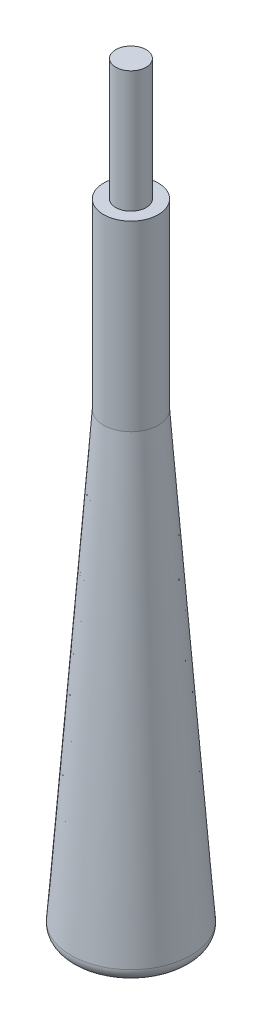
ISO-10303-21;
HEADER;
FILE_DESCRIPTION(('STEP AP214'),'2;1');
FILE_NAME('part.step','',(''),(''),'','','');
FILE_SCHEMA(('AUTOMOTIVE_DESIGN { 1 0 10303 214 1 1 1 1 }'));
ENDSEC;
DATA;
#1=APPLICATION_CONTEXT('core data for automotive mechanical design processes');
#2=APPLICATION_PROTOCOL_DEFINITION('international standard','automotive_design',2000,#1);
#3=PRODUCT_CONTEXT('',#1,'mechanical');
#4=PRODUCT('Part','Part','',(#3));
#5=PRODUCT_RELATED_PRODUCT_CATEGORY('part','',(#4));
#6=PRODUCT_DEFINITION_FORMATION('','',#4);
#7=PRODUCT_DEFINITION_CONTEXT('part definition',#1,'design');
#8=PRODUCT_DEFINITION('design','',#6,#7);
#9=PRODUCT_DEFINITION_SHAPE('','',#8);
#10=(LENGTH_UNIT() NAMED_UNIT(*) SI_UNIT(.MILLI.,.METRE.));
#11=(NAMED_UNIT(*) PLANE_ANGLE_UNIT() SI_UNIT($,.RADIAN.));
#12=(NAMED_UNIT(*) SI_UNIT($,.STERADIAN.) SOLID_ANGLE_UNIT());
#13=UNCERTAINTY_MEASURE_WITH_UNIT(LENGTH_MEASURE(1.E-05),#10,'distance_accuracy_value','');
#14=(GEOMETRIC_REPRESENTATION_CONTEXT(3) GLOBAL_UNCERTAINTY_ASSIGNED_CONTEXT((#13)) GLOBAL_UNIT_ASSIGNED_CONTEXT((#10,
#11,#12)) REPRESENTATION_CONTEXT('',''));
#15=CARTESIAN_POINT('',(0.,0.,0.));
#16=DIRECTION('',(0.,0.,1.));
#17=DIRECTION('',(1.,0.,0.));
#18=AXIS2_PLACEMENT_3D('',#15,#16,#17);
#19=CARTESIAN_POINT('',(0.,20.,-1.11022302462516E-13));
#20=DIRECTION('',(0.,-1.,0.));
#21=DIRECTION('',(0.,0.,-1.));
#22=AXIS2_PLACEMENT_3D('',#19,#20,#21);
#23=CYLINDRICAL_SURFACE('',#22,2.5);
#24=CARTESIAN_POINT('',(0.,20.,-1.11022302462516E-13));
#25=DIRECTION('',(0.,1.,0.));
#26=DIRECTION('',(0.,0.,1.));
#27=AXIS2_PLACEMENT_3D('',#24,#25,#26);
#28=CIRCLE('',#27,2.5);
#29=CARTESIAN_POINT('',(0.,20.,2.49999999999989));
#30=VERTEX_POINT('',#29);
#31=EDGE_CURVE('E51',#30,#30,#28,.T.);
#32=ORIENTED_EDGE('',*,*,#31,.F.);
#33=EDGE_LOOP('',(#32));
#34=FACE_BOUND('',#33,.T.);
#35=CARTESIAN_POINT('',(0.,0.,0.));
#36=DIRECTION('',(0.,1.,0.));
#37=DIRECTION('',(0.,0.,1.));
#38=AXIS2_PLACEMENT_3D('',#35,#36,#37);
#39=CIRCLE('',#38,2.5);
#40=CARTESIAN_POINT('',(0.,0.,2.5));
#41=VERTEX_POINT('',#40);
#42=EDGE_CURVE('E55',#41,#41,#39,.T.);
#43=ORIENTED_EDGE('',*,*,#42,.T.);
#44=EDGE_LOOP('',(#43));
#45=FACE_BOUND('',#44,.T.);
#46=ADVANCED_FACE('F40',(#34,#45),#23,.T.);
#47=CARTESIAN_POINT('',(0.,20.,-1.11022302462516E-13));
#48=DIRECTION('',(0.,1.,0.));
#49=DIRECTION('',(0.,0.,1.));
#50=AXIS2_PLACEMENT_3D('',#47,#48,#49);
#51=PLANE('',#50);
#52=ORIENTED_EDGE('',*,*,#31,.T.);
#53=EDGE_LOOP('',(#52));
#54=FACE_BOUND('',#53,.T.);
#55=ADVANCED_FACE('F92',(#54),#51,.T.);
#56=CARTESIAN_POINT('',(0.,-30.,-1.11022302462516E-13));
#57=DIRECTION('',(0.,1.,0.));
#58=DIRECTION('',(0.,0.,1.));
#59=AXIS2_PLACEMENT_3D('',#56,#57,#58);
#60=CYLINDRICAL_SURFACE('',#59,4.5);
#61=CARTESIAN_POINT('',(0.,-30.,-1.11022302462516E-13));
#62=DIRECTION('',(0.,-1.,0.));
#63=DIRECTION('',(0.,0.,-1.));
#64=AXIS2_PLACEMENT_3D('',#61,#62,#63);
#65=CIRCLE('',#64,4.5);
#66=CARTESIAN_POINT('',(0.,-30.,-4.50000000000011));
#67=VERTEX_POINT('',#66);
#68=EDGE_CURVE('E59',#67,#67,#65,.T.);
#69=ORIENTED_EDGE('',*,*,#68,.F.);
#70=EDGE_LOOP('',(#69));
#71=FACE_BOUND('',#70,.T.);
#72=CARTESIAN_POINT('',(0.,0.,0.));
#73=DIRECTION('',(0.,-1.,0.));
#74=DIRECTION('',(0.,0.,-1.));
#75=AXIS2_PLACEMENT_3D('',#72,#73,#74);
#76=CIRCLE('',#75,4.5);
#77=CARTESIAN_POINT('',(0.,0.,-4.5));
#78=VERTEX_POINT('',#77);
#79=EDGE_CURVE('E61',#78,#78,#76,.T.);
#80=ORIENTED_EDGE('',*,*,#79,.T.);
#81=EDGE_LOOP('',(#80));
#82=FACE_BOUND('',#81,.T.);
#83=ADVANCED_FACE('F97',(#71,#82),#60,.T.);
#84=CARTESIAN_POINT('',(0.,0.,0.));
#85=DIRECTION('',(0.,-1.,0.));
#86=DIRECTION('',(0.,0.,-1.));
#87=AXIS2_PLACEMENT_3D('',#84,#85,#86);
#88=PLANE('',#87);
#89=ORIENTED_EDGE('',*,*,#42,.F.);
#90=EDGE_LOOP('',(#89));
#91=FACE_BOUND('',#90,.T.);
#92=ORIENTED_EDGE('',*,*,#79,.F.);
#93=EDGE_LOOP('',(#92));
#94=FACE_BOUND('',#93,.T.);
#95=ADVANCED_FACE('F104',(#91,#94),#88,.F.);
#96=CARTESIAN_POINT('',(10.,-105.,-2.22044604925031E-13));
#97=DIRECTION('',(0.,1.,0.));
#98=DIRECTION('',(0.,0.,1.));
#99=AXIS2_PLACEMENT_3D('',#96,#97,#98);
#100=PLANE('',#99);
#101=CARTESIAN_POINT('',(0.,-105.,0.));
#102=DIRECTION('',(0.,1.,0.));
#103=DIRECTION('',(0.,0.,1.));
#104=AXIS2_PLACEMENT_3D('',#101,#102,#103);
#105=CIRCLE('',#104,7.84796276630312);
#106=CARTESIAN_POINT('',(0.,-105.,7.84796276630312));
#107=VERTEX_POINT('',#106);
#108=EDGE_CURVE('E10',#107,#107,#105,.F.);
#109=ORIENTED_EDGE('',*,*,#108,.T.);
#110=EDGE_LOOP('',(#109));
#111=FACE_BOUND('',#110,.T.);
#112=CARTESIAN_POINT('',(0.,-105.,0.));
#113=DIRECTION('',(0.,1.,0.));
#114=DIRECTION('',(0.,0.,1.));
#115=AXIS2_PLACEMENT_3D('',#112,#113,#114);
#116=CIRCLE('',#115,7.25);
#117=CARTESIAN_POINT('',(0.,-105.,7.25000000000001));
#118=VERTEX_POINT('',#117);
#119=EDGE_CURVE('E69',#118,#118,#116,.T.);
#120=ORIENTED_EDGE('',*,*,#119,.T.);
#121=EDGE_LOOP('',(#120));
#122=FACE_BOUND('',#121,.T.);
#123=ADVANCED_FACE('F73',(#111,#122),#100,.F.);
#124=CARTESIAN_POINT('',(0.,-105.,0.));
#125=DIRECTION('',(0.,-1.,0.));
#126=DIRECTION('',(0.,0.,-1.));
#127=AXIS2_PLACEMENT_3D('',#124,#125,#126);
#128=CONICAL_SURFACE('',#127,10.,0.0732022990878972);
#129=CARTESIAN_POINT('',(0.,-102.853726120172,-1.11022302462516E-13));
#130=DIRECTION('',(0.,1.,0.));
#131=DIRECTION('',(0.,0.,1.));
#132=AXIS2_PLACEMENT_3D('',#129,#130,#131);
#133=CIRCLE('',#132,9.84260658214592);
#134=CARTESIAN_POINT('',(0.,-102.853726120172,9.84260658214581));
#135=VERTEX_POINT('',#134);
#136=EDGE_CURVE('E47',#135,#135,#133,.T.);
#137=ORIENTED_EDGE('',*,*,#136,.T.);
#138=EDGE_LOOP('',(#137));
#139=FACE_BOUND('',#138,.T.);
#140=ORIENTED_EDGE('',*,*,#68,.T.);
#141=EDGE_LOOP('',(#140));
#142=FACE_BOUND('',#141,.T.);
#143=ADVANCED_FACE('F79',(#139,#142),#128,.T.);
#144=CARTESIAN_POINT('',(0.,-30.,-1.11022302462516E-13));
#145=DIRECTION('',(0.,-1.,0.));
#146=DIRECTION('',(0.,0.,-1.));
#147=AXIS2_PLACEMENT_3D('',#144,#145,#146);
#148=CONICAL_SURFACE('',#147,2.5,0.0632488575330733);
#149=ORIENTED_EDGE('',*,*,#119,.F.);
#150=EDGE_LOOP('',(#149));
#151=FACE_BOUND('',#150,.T.);
#152=CARTESIAN_POINT('',(0.,-30.,-1.11022302462516E-13));
#153=DIRECTION('',(0.,1.,0.));
#154=DIRECTION('',(0.,0.,1.));
#155=AXIS2_PLACEMENT_3D('',#152,#153,#154);
#156=CIRCLE('',#155,2.5);
#157=CARTESIAN_POINT('',(0.,-30.,2.49999999999989));
#158=VERTEX_POINT('',#157);
#159=EDGE_CURVE('E64',#158,#158,#156,.T.);
#160=ORIENTED_EDGE('',*,*,#159,.T.);
#161=EDGE_LOOP('',(#160));
#162=FACE_BOUND('',#161,.T.);
#163=ADVANCED_FACE('F75',(#151,#162),#148,.F.);
#164=CARTESIAN_POINT('',(0.,-30.,-1.11022302462516E-13));
#165=DIRECTION('',(0.,-1.,0.));
#166=DIRECTION('',(0.,0.,-1.));
#167=AXIS2_PLACEMENT_3D('',#164,#165,#166);
#168=PLANE('',#167);
#169=ORIENTED_EDGE('',*,*,#159,.F.);
#170=EDGE_LOOP('',(#169));
#171=FACE_BOUND('',#170,.T.);
#172=ADVANCED_FACE('F78',(#171),#168,.T.);
#173=CARTESIAN_POINT('',(0.,-103.,-1.11022302462516E-13));
#174=DIRECTION('',(0.,1.,0.));
#175=DIRECTION('',(0.,0.,1.));
#176=AXIS2_PLACEMENT_3D('',#173,#174,#175);
#177=TOROIDAL_SURFACE('',#176,7.84796276630312,2.);
#178=ORIENTED_EDGE('',*,*,#108,.F.);
#179=EDGE_LOOP('',(#178));
#180=FACE_BOUND('',#179,.T.);
#181=ORIENTED_EDGE('',*,*,#136,.F.);
#182=EDGE_LOOP('',(#181));
#183=FACE_BOUND('',#182,.T.);
#184=ADVANCED_FACE('F42',(#180,#183),#177,.T.);
#185=CLOSED_SHELL('',(#46,#55,#83,#95,#123,#143,#163,#172,#184));
#186=MANIFOLD_SOLID_BREP('B2',#185);
#187=ADVANCED_BREP_SHAPE_REPRESENTATION('',(#18,#186),#14);
#188=SHAPE_DEFINITION_REPRESENTATION(#9,#187);
ENDSEC;
END-ISO-10303-21;
